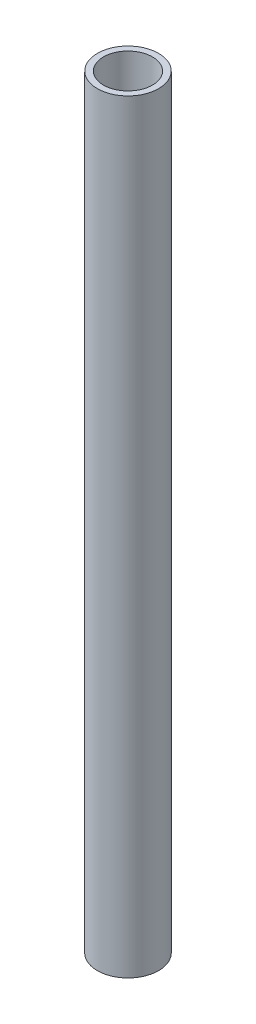
ISO-10303-21;
HEADER;
FILE_DESCRIPTION(('STEP AP214'),'2;1');
FILE_NAME('part.step','',(''),(''),'','','');
FILE_SCHEMA(('AUTOMOTIVE_DESIGN { 1 0 10303 214 1 1 1 1 }'));
ENDSEC;
DATA;
#1=APPLICATION_CONTEXT('core data for automotive mechanical design processes');
#2=APPLICATION_PROTOCOL_DEFINITION('international standard','automotive_design',2000,#1);
#3=PRODUCT_CONTEXT('',#1,'mechanical');
#4=PRODUCT('Part','Part','',(#3));
#5=PRODUCT_RELATED_PRODUCT_CATEGORY('part','',(#4));
#6=PRODUCT_DEFINITION_FORMATION('','',#4);
#7=PRODUCT_DEFINITION_CONTEXT('part definition',#1,'design');
#8=PRODUCT_DEFINITION('design','',#6,#7);
#9=PRODUCT_DEFINITION_SHAPE('','',#8);
#10=(LENGTH_UNIT() NAMED_UNIT(*) SI_UNIT(.MILLI.,.METRE.));
#11=(NAMED_UNIT(*) PLANE_ANGLE_UNIT() SI_UNIT($,.RADIAN.));
#12=(NAMED_UNIT(*) SI_UNIT($,.STERADIAN.) SOLID_ANGLE_UNIT());
#13=UNCERTAINTY_MEASURE_WITH_UNIT(LENGTH_MEASURE(1.E-05),#10,'distance_accuracy_value','');
#14=(GEOMETRIC_REPRESENTATION_CONTEXT(3) GLOBAL_UNCERTAINTY_ASSIGNED_CONTEXT((#13)) GLOBAL_UNIT_ASSIGNED_CONTEXT((#10,
#11,#12)) REPRESENTATION_CONTEXT('',''));
#15=CARTESIAN_POINT('',(0.,0.,0.));
#16=DIRECTION('',(0.,0.,1.));
#17=DIRECTION('',(1.,0.,0.));
#18=AXIS2_PLACEMENT_3D('',#15,#16,#17);
#19=CARTESIAN_POINT('',(0.,31.2,0.));
#20=DIRECTION('',(0.,1.,0.));
#21=DIRECTION('',(0.,0.,1.));
#22=AXIS2_PLACEMENT_3D('',#19,#20,#21);
#23=PLANE('',#22);
#24=CARTESIAN_POINT('',(0.,31.2,0.));
#25=DIRECTION('',(0.,1.,0.));
#26=DIRECTION('',(0.,0.,1.));
#27=AXIS2_PLACEMENT_3D('',#24,#25,#26);
#28=CIRCLE('',#27,1.25);
#29=CARTESIAN_POINT('',(0.,31.2,1.25));
#30=VERTEX_POINT('',#29);
#31=EDGE_CURVE('E10',#30,#30,#28,.T.);
#32=ORIENTED_EDGE('',*,*,#31,.T.);
#33=EDGE_LOOP('',(#32));
#34=FACE_BOUND('',#33,.T.);
#35=CARTESIAN_POINT('',(0.,31.2,0.));
#36=DIRECTION('',(0.,1.,0.));
#37=DIRECTION('',(0.,0.,1.));
#38=AXIS2_PLACEMENT_3D('',#35,#36,#37);
#39=CIRCLE('',#38,1.);
#40=CARTESIAN_POINT('',(0.,31.2,1.));
#41=VERTEX_POINT('',#40);
#42=EDGE_CURVE('E41',#41,#41,#39,.T.);
#43=ORIENTED_EDGE('',*,*,#42,.F.);
#44=EDGE_LOOP('',(#43));
#45=FACE_BOUND('',#44,.T.);
#46=ADVANCED_FACE('F30',(#34,#45),#23,.T.);
#47=CARTESIAN_POINT('',(0.,0.,0.));
#48=DIRECTION('',(0.,1.,0.));
#49=DIRECTION('',(0.,0.,1.));
#50=AXIS2_PLACEMENT_3D('',#47,#48,#49);
#51=PLANE('',#50);
#52=CARTESIAN_POINT('',(0.,0.,0.));
#53=DIRECTION('',(0.,1.,0.));
#54=DIRECTION('',(0.,0.,1.));
#55=AXIS2_PLACEMENT_3D('',#52,#53,#54);
#56=CIRCLE('',#55,1.25);
#57=CARTESIAN_POINT('',(0.,0.,1.25));
#58=VERTEX_POINT('',#57);
#59=EDGE_CURVE('E34',#58,#58,#56,.T.);
#60=ORIENTED_EDGE('',*,*,#59,.F.);
#61=EDGE_LOOP('',(#60));
#62=FACE_BOUND('',#61,.T.);
#63=CARTESIAN_POINT('',(0.,0.,0.));
#64=DIRECTION('',(0.,1.,0.));
#65=DIRECTION('',(0.,0.,1.));
#66=AXIS2_PLACEMENT_3D('',#63,#64,#65);
#67=CIRCLE('',#66,1.);
#68=CARTESIAN_POINT('',(0.,0.,1.));
#69=VERTEX_POINT('',#68);
#70=EDGE_CURVE('E43',#69,#69,#67,.T.);
#71=ORIENTED_EDGE('',*,*,#70,.T.);
#72=EDGE_LOOP('',(#71));
#73=FACE_BOUND('',#72,.T.);
#74=ADVANCED_FACE('F53',(#62,#73),#51,.F.);
#75=CARTESIAN_POINT('',(0.,31.2,0.));
#76=DIRECTION('',(0.,-1.,0.));
#77=DIRECTION('',(0.,0.,-1.));
#78=AXIS2_PLACEMENT_3D('',#75,#76,#77);
#79=CYLINDRICAL_SURFACE('',#78,1.25);
#80=ORIENTED_EDGE('',*,*,#31,.F.);
#81=EDGE_LOOP('',(#80));
#82=FACE_BOUND('',#81,.T.);
#83=ORIENTED_EDGE('',*,*,#59,.T.);
#84=EDGE_LOOP('',(#83));
#85=FACE_BOUND('',#84,.T.);
#86=ADVANCED_FACE('F32',(#82,#85),#79,.T.);
#87=CARTESIAN_POINT('',(0.,31.2,0.));
#88=DIRECTION('',(0.,-1.,0.));
#89=DIRECTION('',(0.,0.,-1.));
#90=AXIS2_PLACEMENT_3D('',#87,#88,#89);
#91=CYLINDRICAL_SURFACE('',#90,1.);
#92=ORIENTED_EDGE('',*,*,#42,.T.);
#93=EDGE_LOOP('',(#92));
#94=FACE_BOUND('',#93,.T.);
#95=ORIENTED_EDGE('',*,*,#70,.F.);
#96=EDGE_LOOP('',(#95));
#97=FACE_BOUND('',#96,.T.);
#98=ADVANCED_FACE('F49',(#94,#97),#91,.F.);
#99=CLOSED_SHELL('',(#46,#74,#86,#98));
#100=MANIFOLD_SOLID_BREP('B2',#99);
#101=ADVANCED_BREP_SHAPE_REPRESENTATION('',(#18,#100),#14);
#102=SHAPE_DEFINITION_REPRESENTATION(#9,#101);
ENDSEC;
END-ISO-10303-21;
